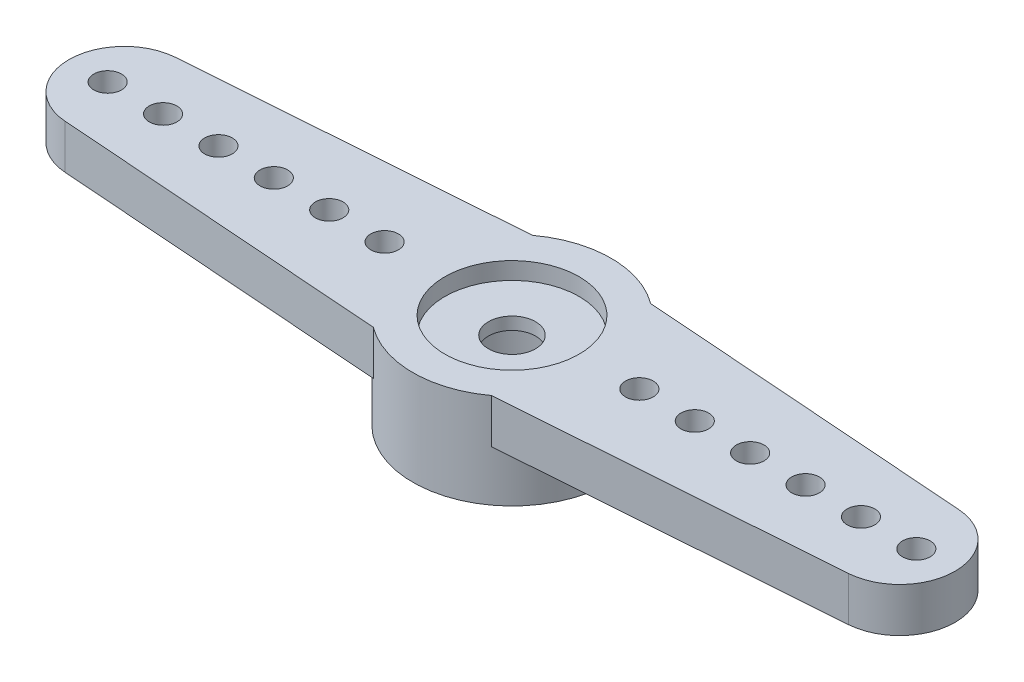
ISO-10303-21;
HEADER;
FILE_DESCRIPTION(('STEP AP214'),'2;1');
FILE_NAME('part.step','',(''),(''),'','','');
FILE_SCHEMA(('AUTOMOTIVE_DESIGN { 1 0 10303 214 1 1 1 1 }'));
ENDSEC;
DATA;
#1=APPLICATION_CONTEXT('core data for automotive mechanical design processes');
#2=APPLICATION_PROTOCOL_DEFINITION('international standard','automotive_design',2000,#1);
#3=PRODUCT_CONTEXT('',#1,'mechanical');
#4=PRODUCT('Part','Part','',(#3));
#5=PRODUCT_RELATED_PRODUCT_CATEGORY('part','',(#4));
#6=PRODUCT_DEFINITION_FORMATION('','',#4);
#7=PRODUCT_DEFINITION_CONTEXT('part definition',#1,'design');
#8=PRODUCT_DEFINITION('design','',#6,#7);
#9=PRODUCT_DEFINITION_SHAPE('','',#8);
#10=(LENGTH_UNIT() NAMED_UNIT(*) SI_UNIT(.MILLI.,.METRE.));
#11=(NAMED_UNIT(*) PLANE_ANGLE_UNIT() SI_UNIT($,.RADIAN.));
#12=(NAMED_UNIT(*) SI_UNIT($,.STERADIAN.) SOLID_ANGLE_UNIT());
#13=UNCERTAINTY_MEASURE_WITH_UNIT(LENGTH_MEASURE(1.E-05),#10,'distance_accuracy_value','');
#14=(GEOMETRIC_REPRESENTATION_CONTEXT(3) GLOBAL_UNCERTAINTY_ASSIGNED_CONTEXT((#13)) GLOBAL_UNIT_ASSIGNED_CONTEXT((#10,
#11,#12)) REPRESENTATION_CONTEXT('',''));
#15=CARTESIAN_POINT('',(0.,0.,0.));
#16=DIRECTION('',(0.,0.,1.));
#17=DIRECTION('',(1.,0.,0.));
#18=AXIS2_PLACEMENT_3D('',#15,#16,#17);
#19=CARTESIAN_POINT('',(5.9,12.67,-5.9));
#20=DIRECTION('',(0.,1.,0.));
#21=DIRECTION('',(0.,0.,1.));
#22=AXIS2_PLACEMENT_3D('',#19,#20,#21);
#23=PLANE('',#22);
#24=CARTESIAN_POINT('',(-2.7,12.67,-5.9));
#25=DIRECTION('',(0.,-1.,0.));
#26=DIRECTION('',(0.,0.,-1.));
#27=AXIS2_PLACEMENT_3D('',#24,#25,#26);
#28=CIRCLE('',#27,0.499999999999988);
#29=CARTESIAN_POINT('',(-2.7,12.67,-6.39999999999999));
#30=VERTEX_POINT('',#29);
#31=EDGE_CURVE('E491',#30,#30,#28,.T.);
#32=ORIENTED_EDGE('',*,*,#31,.F.);
#33=EDGE_LOOP('',(#32));
#34=FACE_BOUND('',#33,.T.);
#35=CARTESIAN_POINT('',(-6.7,12.67,-5.9));
#36=DIRECTION('',(0.,-1.,0.));
#37=DIRECTION('',(0.,0.,-1.));
#38=AXIS2_PLACEMENT_3D('',#35,#36,#37);
#39=CIRCLE('',#38,0.499999999999988);
#40=CARTESIAN_POINT('',(-6.7,12.67,-6.39999999999999));
#41=VERTEX_POINT('',#40);
#42=EDGE_CURVE('E493',#41,#41,#39,.T.);
#43=ORIENTED_EDGE('',*,*,#42,.F.);
#44=EDGE_LOOP('',(#43));
#45=FACE_BOUND('',#44,.T.);
#46=CARTESIAN_POINT('',(-8.7,12.67,-5.9));
#47=DIRECTION('',(0.,-1.,0.));
#48=DIRECTION('',(0.,0.,-1.));
#49=AXIS2_PLACEMENT_3D('',#46,#47,#48);
#50=CIRCLE('',#49,0.499999999999988);
#51=CARTESIAN_POINT('',(-8.7,12.67,-6.39999999999999));
#52=VERTEX_POINT('',#51);
#53=EDGE_CURVE('E499',#52,#52,#50,.T.);
#54=ORIENTED_EDGE('',*,*,#53,.F.);
#55=EDGE_LOOP('',(#54));
#56=FACE_BOUND('',#55,.T.);
#57=CARTESIAN_POINT('',(-0.699999999999997,12.67,-5.9));
#58=DIRECTION('',(0.,-1.,0.));
#59=DIRECTION('',(0.,0.,-1.));
#60=AXIS2_PLACEMENT_3D('',#57,#58,#59);
#61=CIRCLE('',#60,0.499999999999988);
#62=CARTESIAN_POINT('',(-0.699999999999997,12.67,-6.39999999999999));
#63=VERTEX_POINT('',#62);
#64=EDGE_CURVE('E507',#63,#63,#61,.T.);
#65=ORIENTED_EDGE('',*,*,#64,.F.);
#66=EDGE_LOOP('',(#65));
#67=FACE_BOUND('',#66,.T.);
#68=CARTESIAN_POINT('',(1.3,12.67,-5.9));
#69=DIRECTION('',(0.,-1.,0.));
#70=DIRECTION('',(0.,0.,-1.));
#71=AXIS2_PLACEMENT_3D('',#68,#69,#70);
#72=CIRCLE('',#71,0.499999999999988);
#73=CARTESIAN_POINT('',(1.3,12.67,-6.39999999999999));
#74=VERTEX_POINT('',#73);
#75=EDGE_CURVE('E535',#74,#74,#72,.T.);
#76=ORIENTED_EDGE('',*,*,#75,.F.);
#77=EDGE_LOOP('',(#76));
#78=FACE_BOUND('',#77,.T.);
#79=CARTESIAN_POINT('',(5.9,12.67,-5.9));
#80=DIRECTION('',(0.,-1.,0.));
#81=DIRECTION('',(0.,0.,-1.));
#82=AXIS2_PLACEMENT_3D('',#79,#80,#81);
#83=CIRCLE('',#82,3.58);
#84=CARTESIAN_POINT('',(3.76674544416284,12.67,-3.025));
#85=VERTEX_POINT('',#84);
#86=CARTESIAN_POINT('',(3.76674544416284,12.67,-8.775));
#87=VERTEX_POINT('',#86);
#88=EDGE_CURVE('E11',#85,#87,#83,.T.);
#89=ORIENTED_EDGE('',*,*,#88,.F.);
#90=DIRECTION('',(0.997325531387097,0.,0.0730875122264068));
#91=VECTOR('',#90,1.);
#92=CARTESIAN_POINT('',(-8.24617502445281,12.67,-3.90534893722581));
#93=LINE('',#92,#91);
#94=CARTESIAN_POINT('',(-8.24617502445281,12.67,-3.90534893722581));
#95=VERTEX_POINT('',#94);
#96=EDGE_CURVE('E123',#95,#85,#93,.T.);
#97=ORIENTED_EDGE('',*,*,#96,.F.);
#98=CARTESIAN_POINT('',(-8.09999999999999,12.67,-5.9));
#99=DIRECTION('',(0.,1.,0.));
#100=DIRECTION('',(0.,0.,1.));
#101=AXIS2_PLACEMENT_3D('',#98,#99,#100);
#102=CIRCLE('',#101,2.);
#103=CARTESIAN_POINT('',(-8.24617502445281,12.67,-7.8946510627742));
#104=VERTEX_POINT('',#103);
#105=EDGE_CURVE('E120',#104,#95,#102,.T.);
#106=ORIENTED_EDGE('',*,*,#105,.F.);
#107=DIRECTION('',(-0.997325531387097,0.,0.0730875122264058));
#108=VECTOR('',#107,1.);
#109=CARTESIAN_POINT('',(3.76674544416284,12.67,-8.775));
#110=LINE('',#109,#108);
#111=EDGE_CURVE('E111',#87,#104,#110,.T.);
#112=ORIENTED_EDGE('',*,*,#111,.F.);
#113=EDGE_LOOP('',(#89,#97,#106,#112));
#114=FACE_BOUND('',#113,.T.);
#115=CARTESIAN_POINT('',(-4.7,12.67,-5.9));
#116=DIRECTION('',(0.,-1.,0.));
#117=DIRECTION('',(0.,0.,-1.));
#118=AXIS2_PLACEMENT_3D('',#115,#116,#117);
#119=CIRCLE('',#118,0.499999999999988);
#120=CARTESIAN_POINT('',(-4.7,12.67,-6.39999999999999));
#121=VERTEX_POINT('',#120);
#122=EDGE_CURVE('E503',#121,#121,#119,.T.);
#123=ORIENTED_EDGE('',*,*,#122,.F.);
#124=EDGE_LOOP('',(#123));
#125=FACE_BOUND('',#124,.T.);
#126=ADVANCED_FACE('F32',(#34,#45,#56,#67,#78,#114,#125),#23,.F.);
#127=CARTESIAN_POINT('',(10.5,12.67,-5.9));
#128=DIRECTION('',(0.,-1.,0.));
#129=DIRECTION('',(0.,0.,-1.));
#130=AXIS2_PLACEMENT_3D('',#127,#128,#129);
#131=CIRCLE('',#130,0.499999999999988);
#132=CARTESIAN_POINT('',(10.5,12.67,-6.39999999999999));
#133=VERTEX_POINT('',#132);
#134=EDGE_CURVE('E511',#133,#133,#131,.T.);
#135=ORIENTED_EDGE('',*,*,#134,.F.);
#136=EDGE_LOOP('',(#135));
#137=FACE_BOUND('',#136,.T.);
#138=CARTESIAN_POINT('',(14.5,12.67,-5.9));
#139=DIRECTION('',(0.,-1.,0.));
#140=DIRECTION('',(0.,0.,-1.));
#141=AXIS2_PLACEMENT_3D('',#138,#139,#140);
#142=CIRCLE('',#141,0.499999999999988);
#143=CARTESIAN_POINT('',(14.5,12.67,-6.39999999999999));
#144=VERTEX_POINT('',#143);
#145=EDGE_CURVE('E515',#144,#144,#142,.T.);
#146=ORIENTED_EDGE('',*,*,#145,.F.);
#147=EDGE_LOOP('',(#146));
#148=FACE_BOUND('',#147,.T.);
#149=CARTESIAN_POINT('',(18.5,12.67,-5.9));
#150=DIRECTION('',(0.,-1.,0.));
#151=DIRECTION('',(0.,0.,-1.));
#152=AXIS2_PLACEMENT_3D('',#149,#150,#151);
#153=CIRCLE('',#152,0.499999999999987);
#154=CARTESIAN_POINT('',(18.5,12.67,-6.39999999999999));
#155=VERTEX_POINT('',#154);
#156=EDGE_CURVE('E519',#155,#155,#153,.T.);
#157=ORIENTED_EDGE('',*,*,#156,.F.);
#158=EDGE_LOOP('',(#157));
#159=FACE_BOUND('',#158,.T.);
#160=CARTESIAN_POINT('',(20.5,12.67,-5.9));
#161=DIRECTION('',(0.,-1.,0.));
#162=DIRECTION('',(0.,0.,-1.));
#163=AXIS2_PLACEMENT_3D('',#160,#161,#162);
#164=CIRCLE('',#163,0.499999999999987);
#165=CARTESIAN_POINT('',(20.5,12.67,-6.39999999999999));
#166=VERTEX_POINT('',#165);
#167=EDGE_CURVE('E523',#166,#166,#164,.T.);
#168=ORIENTED_EDGE('',*,*,#167,.F.);
#169=EDGE_LOOP('',(#168));
#170=FACE_BOUND('',#169,.T.);
#171=CARTESIAN_POINT('',(16.5,12.67,-5.9));
#172=DIRECTION('',(0.,-1.,0.));
#173=DIRECTION('',(0.,0.,-1.));
#174=AXIS2_PLACEMENT_3D('',#171,#172,#173);
#175=CIRCLE('',#174,0.499999999999987);
#176=CARTESIAN_POINT('',(16.5,12.67,-6.39999999999999));
#177=VERTEX_POINT('',#176);
#178=EDGE_CURVE('E527',#177,#177,#175,.T.);
#179=ORIENTED_EDGE('',*,*,#178,.F.);
#180=EDGE_LOOP('',(#179));
#181=FACE_BOUND('',#180,.T.);
#182=CARTESIAN_POINT('',(12.5,12.67,-5.9));
#183=DIRECTION('',(0.,-1.,0.));
#184=DIRECTION('',(0.,0.,-1.));
#185=AXIS2_PLACEMENT_3D('',#182,#183,#184);
#186=CIRCLE('',#185,0.499999999999988);
#187=CARTESIAN_POINT('',(12.5,12.67,-6.39999999999999));
#188=VERTEX_POINT('',#187);
#189=EDGE_CURVE('E531',#188,#188,#186,.T.);
#190=ORIENTED_EDGE('',*,*,#189,.F.);
#191=EDGE_LOOP('',(#190));
#192=FACE_BOUND('',#191,.T.);
#193=CARTESIAN_POINT('',(8.03325455583716,12.67,-8.775));
#194=VERTEX_POINT('',#193);
#195=CARTESIAN_POINT('',(8.03325455583716,12.67,-3.025));
#196=VERTEX_POINT('',#195);
#197=EDGE_CURVE('E44',#194,#196,#83,.T.);
#198=ORIENTED_EDGE('',*,*,#197,.F.);
#199=DIRECTION('',(-0.997325531387097,0.,-0.0730875122264069));
#200=VECTOR('',#199,1.);
#201=CARTESIAN_POINT('',(20.0461750244528,12.67,-7.89465106277419));
#202=LINE('',#201,#200);
#203=CARTESIAN_POINT('',(20.0461750244528,12.67,-7.89465106277419));
#204=VERTEX_POINT('',#203);
#205=EDGE_CURVE('E121',#204,#194,#202,.T.);
#206=ORIENTED_EDGE('',*,*,#205,.F.);
#207=CARTESIAN_POINT('',(19.9,12.67,-5.9));
#208=DIRECTION('',(0.,1.,0.));
#209=DIRECTION('',(0.,0.,1.));
#210=AXIS2_PLACEMENT_3D('',#207,#208,#209);
#211=CIRCLE('',#210,2.);
#212=CARTESIAN_POINT('',(20.0461750244528,12.67,-3.90534893722581));
#213=VERTEX_POINT('',#212);
#214=EDGE_CURVE('E126',#213,#204,#211,.T.);
#215=ORIENTED_EDGE('',*,*,#214,.F.);
#216=DIRECTION('',(0.997325531387097,0.,-0.0730875122264059));
#217=VECTOR('',#216,1.);
#218=CARTESIAN_POINT('',(8.03325455583716,12.67,-3.025));
#219=LINE('',#218,#217);
#220=EDGE_CURVE('E152',#196,#213,#219,.T.);
#221=ORIENTED_EDGE('',*,*,#220,.F.);
#222=EDGE_LOOP('',(#198,#206,#215,#221));
#223=FACE_BOUND('',#222,.T.);
#224=ADVANCED_FACE('F172',(#137,#148,#159,#170,#181,#192,#223),#23,.F.);
#225=CARTESIAN_POINT('',(-8.24617502445281,12.67,-3.90534893722581));
#226=DIRECTION('',(-0.0730875122264068,0.,0.997325531387097));
#227=DIRECTION('',(0.997325531387097,0.,0.0730875122264068));
#228=AXIS2_PLACEMENT_3D('',#225,#226,#227);
#229=PLANE('',#228);
#230=DIRECTION('',(0.997325531387097,0.,0.0730875122264068));
#231=VECTOR('',#230,1.);
#232=CARTESIAN_POINT('',(-8.24617502445281,14.27,-3.90534893722581));
#233=LINE('',#232,#231);
#234=CARTESIAN_POINT('',(-8.24617502445281,14.27,-3.90534893722581));
#235=VERTEX_POINT('',#234);
#236=CARTESIAN_POINT('',(3.76674544416284,14.27,-3.025));
#237=VERTEX_POINT('',#236);
#238=EDGE_CURVE('E149',#235,#237,#233,.T.);
#239=ORIENTED_EDGE('',*,*,#238,.F.);
#240=DIRECTION('',(0.,1.,0.));
#241=VECTOR('',#240,1.);
#242=CARTESIAN_POINT('',(-8.24617502445281,12.67,-3.90534893722581));
#243=LINE('',#242,#241);
#244=EDGE_CURVE('E52',#95,#235,#243,.T.);
#245=ORIENTED_EDGE('',*,*,#244,.F.);
#246=ORIENTED_EDGE('',*,*,#96,.T.);
#247=DIRECTION('',(0.,1.,0.));
#248=VECTOR('',#247,1.);
#249=CARTESIAN_POINT('',(3.76674544416284,12.67,-3.025));
#250=LINE('',#249,#248);
#251=EDGE_CURVE('E42',#85,#237,#250,.T.);
#252=ORIENTED_EDGE('',*,*,#251,.T.);
#253=EDGE_LOOP('',(#239,#245,#246,#252));
#254=FACE_BOUND('',#253,.T.);
#255=ADVANCED_FACE('F169',(#254),#229,.T.);
#256=CARTESIAN_POINT('',(-8.09999999999999,12.67,-5.9));
#257=DIRECTION('',(0.,1.,0.));
#258=DIRECTION('',(0.,0.,1.));
#259=AXIS2_PLACEMENT_3D('',#256,#257,#258);
#260=CYLINDRICAL_SURFACE('',#259,2.);
#261=CARTESIAN_POINT('',(-8.09999999999999,14.27,-5.9));
#262=DIRECTION('',(0.,1.,0.));
#263=DIRECTION('',(0.,0.,1.));
#264=AXIS2_PLACEMENT_3D('',#261,#262,#263);
#265=CIRCLE('',#264,2.);
#266=CARTESIAN_POINT('',(-8.24617502445281,14.27,-7.8946510627742));
#267=VERTEX_POINT('',#266);
#268=EDGE_CURVE('E147',#267,#235,#265,.T.);
#269=ORIENTED_EDGE('',*,*,#268,.F.);
#270=DIRECTION('',(0.,1.,0.));
#271=VECTOR('',#270,1.);
#272=CARTESIAN_POINT('',(-8.24617502445281,12.67,-7.8946510627742));
#273=LINE('',#272,#271);
#274=EDGE_CURVE('E115',#104,#267,#273,.T.);
#275=ORIENTED_EDGE('',*,*,#274,.F.);
#276=ORIENTED_EDGE('',*,*,#105,.T.);
#277=ORIENTED_EDGE('',*,*,#244,.T.);
#278=EDGE_LOOP('',(#269,#275,#276,#277));
#279=FACE_BOUND('',#278,.T.);
#280=ADVANCED_FACE('F171',(#279),#260,.T.);
#281=CARTESIAN_POINT('',(3.76674544416284,12.67,-8.775));
#282=DIRECTION('',(-0.0730875122264058,0.,-0.997325531387097));
#283=DIRECTION('',(-0.997325531387097,0.,0.0730875122264058));
#284=AXIS2_PLACEMENT_3D('',#281,#282,#283);
#285=PLANE('',#284);
#286=DIRECTION('',(-0.997325531387097,0.,0.0730875122264058));
#287=VECTOR('',#286,1.);
#288=CARTESIAN_POINT('',(3.76674544416284,14.27,-8.775));
#289=LINE('',#288,#287);
#290=CARTESIAN_POINT('',(3.76674544416284,14.27,-8.775));
#291=VERTEX_POINT('',#290);
#292=EDGE_CURVE('E113',#291,#267,#289,.T.);
#293=ORIENTED_EDGE('',*,*,#292,.F.);
#294=DIRECTION('',(0.,1.,0.));
#295=VECTOR('',#294,1.);
#296=CARTESIAN_POINT('',(3.76674544416284,12.67,-8.775));
#297=LINE('',#296,#295);
#298=EDGE_CURVE('E103',#87,#291,#297,.T.);
#299=ORIENTED_EDGE('',*,*,#298,.F.);
#300=ORIENTED_EDGE('',*,*,#111,.T.);
#301=ORIENTED_EDGE('',*,*,#274,.T.);
#302=EDGE_LOOP('',(#293,#299,#300,#301));
#303=FACE_BOUND('',#302,.T.);
#304=ADVANCED_FACE('F110',(#303),#285,.T.);
#305=CARTESIAN_POINT('',(5.9,12.67,-5.9));
#306=DIRECTION('',(0.,1.,0.));
#307=DIRECTION('',(0.,0.,1.));
#308=AXIS2_PLACEMENT_3D('',#305,#306,#307);
#309=CYLINDRICAL_SURFACE('',#308,3.58);
#310=CARTESIAN_POINT('',(5.9,14.27,-5.9));
#311=DIRECTION('',(0.,1.,0.));
#312=DIRECTION('',(0.,0.,1.));
#313=AXIS2_PLACEMENT_3D('',#310,#311,#312);
#314=CIRCLE('',#313,3.58);
#315=CARTESIAN_POINT('',(8.03325455583716,14.27,-8.775));
#316=VERTEX_POINT('',#315);
#317=EDGE_CURVE('E144',#316,#291,#314,.T.);
#318=ORIENTED_EDGE('',*,*,#317,.F.);
#319=DIRECTION('',(0.,1.,0.));
#320=VECTOR('',#319,1.);
#321=CARTESIAN_POINT('',(8.03325455583716,12.67,-8.775));
#322=LINE('',#321,#320);
#323=EDGE_CURVE('E116',#194,#316,#322,.T.);
#324=ORIENTED_EDGE('',*,*,#323,.F.);
#325=ORIENTED_EDGE('',*,*,#197,.T.);
#326=DIRECTION('',(0.,1.,0.));
#327=VECTOR('',#326,1.);
#328=CARTESIAN_POINT('',(8.03325455583716,12.67,-3.025));
#329=LINE('',#328,#327);
#330=CARTESIAN_POINT('',(8.03325455583716,14.27,-3.025));
#331=VERTEX_POINT('',#330);
#332=EDGE_CURVE('E36',#196,#331,#329,.T.);
#333=ORIENTED_EDGE('',*,*,#332,.T.);
#334=CARTESIAN_POINT('',(5.9,14.27,-5.9));
#335=DIRECTION('',(0.,1.,0.));
#336=DIRECTION('',(0.,0.,1.));
#337=AXIS2_PLACEMENT_3D('',#334,#335,#336);
#338=CIRCLE('',#337,3.58);
#339=EDGE_CURVE('E131',#237,#331,#338,.T.);
#340=ORIENTED_EDGE('',*,*,#339,.F.);
#341=ORIENTED_EDGE('',*,*,#251,.F.);
#342=ORIENTED_EDGE('',*,*,#88,.T.);
#343=ORIENTED_EDGE('',*,*,#298,.T.);
#344=EDGE_LOOP('',(#318,#324,#325,#333,#340,#341,#342,#343));
#345=FACE_BOUND('',#344,.T.);
#346=CARTESIAN_POINT('',(5.9,10.84,-5.9));
#347=DIRECTION('',(0.,-1.,0.));
#348=DIRECTION('',(0.,0.,-1.));
#349=AXIS2_PLACEMENT_3D('',#346,#347,#348);
#350=CIRCLE('',#349,3.58);
#351=CARTESIAN_POINT('',(5.9,10.84,-9.48));
#352=VERTEX_POINT('',#351);
#353=EDGE_CURVE('E135',#352,#352,#350,.T.);
#354=ORIENTED_EDGE('',*,*,#353,.F.);
#355=EDGE_LOOP('',(#354));
#356=FACE_BOUND('',#355,.T.);
#357=ADVANCED_FACE('F101',(#345,#356),#309,.T.);
#358=CARTESIAN_POINT('',(20.0461750244528,12.67,-7.89465106277419));
#359=DIRECTION('',(0.0730875122264068,0.,-0.997325531387097));
#360=DIRECTION('',(-0.997325531387097,0.,-0.0730875122264069));
#361=AXIS2_PLACEMENT_3D('',#358,#359,#360);
#362=PLANE('',#361);
#363=DIRECTION('',(-0.997325531387097,0.,-0.0730875122264069));
#364=VECTOR('',#363,1.);
#365=CARTESIAN_POINT('',(20.0461750244528,14.27,-7.89465106277419));
#366=LINE('',#365,#364);
#367=CARTESIAN_POINT('',(20.0461750244528,14.27,-7.89465106277419));
#368=VERTEX_POINT('',#367);
#369=EDGE_CURVE('E141',#368,#316,#366,.T.);
#370=ORIENTED_EDGE('',*,*,#369,.F.);
#371=DIRECTION('',(0.,1.,0.));
#372=VECTOR('',#371,1.);
#373=CARTESIAN_POINT('',(20.0461750244528,12.67,-7.89465106277419));
#374=LINE('',#373,#372);
#375=EDGE_CURVE('E157',#204,#368,#374,.T.);
#376=ORIENTED_EDGE('',*,*,#375,.F.);
#377=ORIENTED_EDGE('',*,*,#205,.T.);
#378=ORIENTED_EDGE('',*,*,#323,.T.);
#379=EDGE_LOOP('',(#370,#376,#377,#378));
#380=FACE_BOUND('',#379,.T.);
#381=ADVANCED_FACE('F266',(#380),#362,.T.);
#382=CARTESIAN_POINT('',(19.9,12.67,-5.9));
#383=DIRECTION('',(0.,1.,0.));
#384=DIRECTION('',(0.,0.,1.));
#385=AXIS2_PLACEMENT_3D('',#382,#383,#384);
#386=CYLINDRICAL_SURFACE('',#385,2.);
#387=CARTESIAN_POINT('',(19.9,14.27,-5.9));
#388=DIRECTION('',(0.,1.,0.));
#389=DIRECTION('',(0.,0.,1.));
#390=AXIS2_PLACEMENT_3D('',#387,#388,#389);
#391=CIRCLE('',#390,2.);
#392=CARTESIAN_POINT('',(20.0461750244528,14.27,-3.90534893722581));
#393=VERTEX_POINT('',#392);
#394=EDGE_CURVE('E138',#393,#368,#391,.T.);
#395=ORIENTED_EDGE('',*,*,#394,.F.);
#396=DIRECTION('',(0.,1.,0.));
#397=VECTOR('',#396,1.);
#398=CARTESIAN_POINT('',(20.0461750244528,12.67,-3.90534893722581));
#399=LINE('',#398,#397);
#400=EDGE_CURVE('E91',#213,#393,#399,.T.);
#401=ORIENTED_EDGE('',*,*,#400,.F.);
#402=ORIENTED_EDGE('',*,*,#214,.T.);
#403=ORIENTED_EDGE('',*,*,#375,.T.);
#404=EDGE_LOOP('',(#395,#401,#402,#403));
#405=FACE_BOUND('',#404,.T.);
#406=ADVANCED_FACE('F199',(#405),#386,.T.);
#407=CARTESIAN_POINT('',(8.03325455583716,12.67,-3.025));
#408=DIRECTION('',(0.0730875122264059,0.,0.997325531387097));
#409=DIRECTION('',(0.997325531387097,0.,-0.0730875122264059));
#410=AXIS2_PLACEMENT_3D('',#407,#408,#409);
#411=PLANE('',#410);
#412=DIRECTION('',(0.997325531387097,0.,-0.0730875122264059));
#413=VECTOR('',#412,1.);
#414=CARTESIAN_POINT('',(8.03325455583716,14.27,-3.025));
#415=LINE('',#414,#413);
#416=EDGE_CURVE('E134',#331,#393,#415,.T.);
#417=ORIENTED_EDGE('',*,*,#416,.F.);
#418=ORIENTED_EDGE('',*,*,#332,.F.);
#419=ORIENTED_EDGE('',*,*,#220,.T.);
#420=ORIENTED_EDGE('',*,*,#400,.T.);
#421=EDGE_LOOP('',(#417,#418,#419,#420));
#422=FACE_BOUND('',#421,.T.);
#423=ADVANCED_FACE('F34',(#422),#411,.T.);
#424=CARTESIAN_POINT('',(5.9,14.27,-5.9));
#425=DIRECTION('',(0.,1.,0.));
#426=DIRECTION('',(0.,0.,1.));
#427=AXIS2_PLACEMENT_3D('',#424,#425,#426);
#428=PLANE('',#427);
#429=CARTESIAN_POINT('',(-2.7,14.27,-5.9));
#430=DIRECTION('',(0.,-1.,0.));
#431=DIRECTION('',(0.,0.,-1.));
#432=AXIS2_PLACEMENT_3D('',#429,#430,#431);
#433=CIRCLE('',#432,0.499999999999988);
#434=CARTESIAN_POINT('',(-2.7,14.27,-6.39999999999999));
#435=VERTEX_POINT('',#434);
#436=EDGE_CURVE('E203',#435,#435,#433,.T.);
#437=ORIENTED_EDGE('',*,*,#436,.T.);
#438=EDGE_LOOP('',(#437));
#439=FACE_BOUND('',#438,.T.);
#440=CARTESIAN_POINT('',(-6.7,14.27,-5.9));
#441=DIRECTION('',(0.,-1.,0.));
#442=DIRECTION('',(0.,0.,-1.));
#443=AXIS2_PLACEMENT_3D('',#440,#441,#442);
#444=CIRCLE('',#443,0.499999999999987);
#445=CARTESIAN_POINT('',(-6.7,14.27,-6.39999999999999));
#446=VERTEX_POINT('',#445);
#447=EDGE_CURVE('E207',#446,#446,#444,.T.);
#448=ORIENTED_EDGE('',*,*,#447,.T.);
#449=EDGE_LOOP('',(#448));
#450=FACE_BOUND('',#449,.T.);
#451=CARTESIAN_POINT('',(-8.7,14.27,-5.9));
#452=DIRECTION('',(0.,-1.,0.));
#453=DIRECTION('',(0.,0.,-1.));
#454=AXIS2_PLACEMENT_3D('',#451,#452,#453);
#455=CIRCLE('',#454,0.499999999999988);
#456=CARTESIAN_POINT('',(-8.7,14.27,-6.39999999999999));
#457=VERTEX_POINT('',#456);
#458=EDGE_CURVE('E211',#457,#457,#455,.T.);
#459=ORIENTED_EDGE('',*,*,#458,.T.);
#460=EDGE_LOOP('',(#459));
#461=FACE_BOUND('',#460,.T.);
#462=CARTESIAN_POINT('',(-4.7,14.27,-5.9));
#463=DIRECTION('',(0.,-1.,0.));
#464=DIRECTION('',(0.,0.,-1.));
#465=AXIS2_PLACEMENT_3D('',#462,#463,#464);
#466=CIRCLE('',#465,0.499999999999987);
#467=CARTESIAN_POINT('',(-4.7,14.27,-6.39999999999999));
#468=VERTEX_POINT('',#467);
#469=EDGE_CURVE('E215',#468,#468,#466,.T.);
#470=ORIENTED_EDGE('',*,*,#469,.T.);
#471=EDGE_LOOP('',(#470));
#472=FACE_BOUND('',#471,.T.);
#473=CARTESIAN_POINT('',(-0.699999999999997,14.27,-5.9));
#474=DIRECTION('',(0.,-1.,0.));
#475=DIRECTION('',(0.,0.,-1.));
#476=AXIS2_PLACEMENT_3D('',#473,#474,#475);
#477=CIRCLE('',#476,0.499999999999988);
#478=CARTESIAN_POINT('',(-0.699999999999997,14.27,-6.39999999999999));
#479=VERTEX_POINT('',#478);
#480=EDGE_CURVE('E219',#479,#479,#477,.T.);
#481=ORIENTED_EDGE('',*,*,#480,.T.);
#482=EDGE_LOOP('',(#481));
#483=FACE_BOUND('',#482,.T.);
#484=CARTESIAN_POINT('',(10.5,14.27,-5.9));
#485=DIRECTION('',(0.,-1.,0.));
#486=DIRECTION('',(0.,0.,-1.));
#487=AXIS2_PLACEMENT_3D('',#484,#485,#486);
#488=CIRCLE('',#487,0.499999999999988);
#489=CARTESIAN_POINT('',(10.5,14.27,-6.39999999999999));
#490=VERTEX_POINT('',#489);
#491=EDGE_CURVE('E223',#490,#490,#488,.T.);
#492=ORIENTED_EDGE('',*,*,#491,.T.);
#493=EDGE_LOOP('',(#492));
#494=FACE_BOUND('',#493,.T.);
#495=CARTESIAN_POINT('',(14.5,14.27,-5.9));
#496=DIRECTION('',(0.,-1.,0.));
#497=DIRECTION('',(0.,0.,-1.));
#498=AXIS2_PLACEMENT_3D('',#495,#496,#497);
#499=CIRCLE('',#498,0.499999999999988);
#500=CARTESIAN_POINT('',(14.5,14.27,-6.39999999999999));
#501=VERTEX_POINT('',#500);
#502=EDGE_CURVE('E227',#501,#501,#499,.T.);
#503=ORIENTED_EDGE('',*,*,#502,.T.);
#504=EDGE_LOOP('',(#503));
#505=FACE_BOUND('',#504,.T.);
#506=CARTESIAN_POINT('',(18.5,14.27,-5.9));
#507=DIRECTION('',(0.,-1.,0.));
#508=DIRECTION('',(0.,0.,-1.));
#509=AXIS2_PLACEMENT_3D('',#506,#507,#508);
#510=CIRCLE('',#509,0.499999999999987);
#511=CARTESIAN_POINT('',(18.5,14.27,-6.39999999999999));
#512=VERTEX_POINT('',#511);
#513=EDGE_CURVE('E231',#512,#512,#510,.T.);
#514=ORIENTED_EDGE('',*,*,#513,.T.);
#515=EDGE_LOOP('',(#514));
#516=FACE_BOUND('',#515,.T.);
#517=CARTESIAN_POINT('',(20.5,14.27,-5.9));
#518=DIRECTION('',(0.,-1.,0.));
#519=DIRECTION('',(0.,0.,-1.));
#520=AXIS2_PLACEMENT_3D('',#517,#518,#519);
#521=CIRCLE('',#520,0.499999999999987);
#522=CARTESIAN_POINT('',(20.5,14.27,-6.39999999999999));
#523=VERTEX_POINT('',#522);
#524=EDGE_CURVE('E235',#523,#523,#521,.T.);
#525=ORIENTED_EDGE('',*,*,#524,.T.);
#526=EDGE_LOOP('',(#525));
#527=FACE_BOUND('',#526,.T.);
#528=CARTESIAN_POINT('',(16.5,14.27,-5.9));
#529=DIRECTION('',(0.,-1.,0.));
#530=DIRECTION('',(0.,0.,-1.));
#531=AXIS2_PLACEMENT_3D('',#528,#529,#530);
#532=CIRCLE('',#531,0.499999999999987);
#533=CARTESIAN_POINT('',(16.5,14.27,-6.39999999999999));
#534=VERTEX_POINT('',#533);
#535=EDGE_CURVE('E239',#534,#534,#532,.T.);
#536=ORIENTED_EDGE('',*,*,#535,.T.);
#537=EDGE_LOOP('',(#536));
#538=FACE_BOUND('',#537,.T.);
#539=CARTESIAN_POINT('',(12.5,14.27,-5.9));
#540=DIRECTION('',(0.,-1.,0.));
#541=DIRECTION('',(0.,0.,-1.));
#542=AXIS2_PLACEMENT_3D('',#539,#540,#541);
#543=CIRCLE('',#542,0.499999999999988);
#544=CARTESIAN_POINT('',(12.5,14.27,-6.39999999999999));
#545=VERTEX_POINT('',#544);
#546=EDGE_CURVE('E243',#545,#545,#543,.T.);
#547=ORIENTED_EDGE('',*,*,#546,.T.);
#548=EDGE_LOOP('',(#547));
#549=FACE_BOUND('',#548,.T.);
#550=CARTESIAN_POINT('',(1.3,14.27,-5.9));
#551=DIRECTION('',(0.,-1.,0.));
#552=DIRECTION('',(0.,0.,-1.));
#553=AXIS2_PLACEMENT_3D('',#550,#551,#552);
#554=CIRCLE('',#553,0.499999999999988);
#555=CARTESIAN_POINT('',(1.3,14.27,-6.39999999999999));
#556=VERTEX_POINT('',#555);
#557=EDGE_CURVE('E247',#556,#556,#554,.T.);
#558=ORIENTED_EDGE('',*,*,#557,.T.);
#559=EDGE_LOOP('',(#558));
#560=FACE_BOUND('',#559,.T.);
#561=CARTESIAN_POINT('',(5.9,14.27,-5.9));
#562=DIRECTION('',(0.,-1.,0.));
#563=DIRECTION('',(0.,0.,-1.));
#564=AXIS2_PLACEMENT_3D('',#561,#562,#563);
#565=CIRCLE('',#564,2.425);
#566=CARTESIAN_POINT('',(5.9,14.27,-8.325));
#567=VERTEX_POINT('',#566);
#568=EDGE_CURVE('E250',#567,#567,#565,.T.);
#569=ORIENTED_EDGE('',*,*,#568,.T.);
#570=EDGE_LOOP('',(#569));
#571=FACE_BOUND('',#570,.T.);
#572=ORIENTED_EDGE('',*,*,#339,.T.);
#573=ORIENTED_EDGE('',*,*,#416,.T.);
#574=ORIENTED_EDGE('',*,*,#394,.T.);
#575=ORIENTED_EDGE('',*,*,#369,.T.);
#576=ORIENTED_EDGE('',*,*,#317,.T.);
#577=ORIENTED_EDGE('',*,*,#292,.T.);
#578=ORIENTED_EDGE('',*,*,#268,.T.);
#579=ORIENTED_EDGE('',*,*,#238,.T.);
#580=EDGE_LOOP('',(#572,#573,#574,#575,#576,#577,#578,#579));
#581=FACE_BOUND('',#580,.T.);
#582=ADVANCED_FACE('F168',(#439,#450,#461,#472,#483,#494,#505,#516,#527,#538,#549,#560,#571,
#581),#428,.T.);
#583=CARTESIAN_POINT('',(5.9,10.84,-5.9));
#584=DIRECTION('',(0.,-1.,0.));
#585=DIRECTION('',(0.,0.,-1.));
#586=AXIS2_PLACEMENT_3D('',#583,#584,#585);
#587=PLANE('',#586);
#588=CARTESIAN_POINT('',(5.9,10.84,-5.9));
#589=DIRECTION('',(0.,-1.,0.));
#590=DIRECTION('',(0.,0.,-1.));
#591=AXIS2_PLACEMENT_3D('',#588,#589,#590);
#592=CIRCLE('',#591,2.3);
#593=CARTESIAN_POINT('',(5.9,10.84,-8.2));
#594=VERTEX_POINT('',#593);
#595=EDGE_CURVE('E252',#594,#594,#592,.T.);
#596=ORIENTED_EDGE('',*,*,#595,.F.);
#597=EDGE_LOOP('',(#596));
#598=FACE_BOUND('',#597,.T.);
#599=ORIENTED_EDGE('',*,*,#353,.T.);
#600=EDGE_LOOP('',(#599));
#601=FACE_BOUND('',#600,.T.);
#602=ADVANCED_FACE('F189',(#598,#601),#587,.T.);
#603=CARTESIAN_POINT('',(5.9,14.27,-5.9));
#604=DIRECTION('',(0.,-1.,0.));
#605=DIRECTION('',(0.,0.,-1.));
#606=AXIS2_PLACEMENT_3D('',#603,#604,#605);
#607=CYLINDRICAL_SURFACE('',#606,2.425);
#608=ORIENTED_EDGE('',*,*,#568,.F.);
#609=EDGE_LOOP('',(#608));
#610=FACE_BOUND('',#609,.T.);
#611=CARTESIAN_POINT('',(5.9,13.65,-5.9));
#612=DIRECTION('',(0.,-1.,0.));
#613=DIRECTION('',(0.,0.,-1.));
#614=AXIS2_PLACEMENT_3D('',#611,#612,#613);
#615=CIRCLE('',#614,2.425);
#616=CARTESIAN_POINT('',(5.9,13.65,-8.325));
#617=VERTEX_POINT('',#616);
#618=EDGE_CURVE('E539',#617,#617,#615,.T.);
#619=ORIENTED_EDGE('',*,*,#618,.T.);
#620=EDGE_LOOP('',(#619));
#621=FACE_BOUND('',#620,.T.);
#622=ADVANCED_FACE('F197',(#610,#621),#607,.F.);
#623=CARTESIAN_POINT('',(5.9,14.27,-5.9));
#624=DIRECTION('',(0.,-1.,0.));
#625=DIRECTION('',(0.,0.,-1.));
#626=AXIS2_PLACEMENT_3D('',#623,#624,#625);
#627=CYLINDRICAL_SURFACE('',#626,2.3);
#628=CARTESIAN_POINT('',(5.9,13.2,-5.9));
#629=DIRECTION('',(0.,-1.,0.));
#630=DIRECTION('',(0.,0.,-1.));
#631=AXIS2_PLACEMENT_3D('',#628,#629,#630);
#632=CIRCLE('',#631,2.3);
#633=CARTESIAN_POINT('',(5.9,13.2,-8.2));
#634=VERTEX_POINT('',#633);
#635=EDGE_CURVE('E255',#634,#634,#632,.T.);
#636=ORIENTED_EDGE('',*,*,#635,.F.);
#637=EDGE_LOOP('',(#636));
#638=FACE_BOUND('',#637,.T.);
#639=ORIENTED_EDGE('',*,*,#595,.T.);
#640=EDGE_LOOP('',(#639));
#641=FACE_BOUND('',#640,.T.);
#642=ADVANCED_FACE('F314',(#638,#641),#627,.F.);
#643=CARTESIAN_POINT('',(8.2,13.2,-5.9));
#644=DIRECTION('',(0.,1.,0.));
#645=DIRECTION('',(0.,0.,1.));
#646=AXIS2_PLACEMENT_3D('',#643,#644,#645);
#647=PLANE('',#646);
#648=CARTESIAN_POINT('',(5.9,13.2,-5.9));
#649=DIRECTION('',(0.,-1.,0.));
#650=DIRECTION('',(0.,0.,-1.));
#651=AXIS2_PLACEMENT_3D('',#648,#649,#650);
#652=CIRCLE('',#651,0.850000000000001);
#653=CARTESIAN_POINT('',(5.9,13.2,-6.75));
#654=VERTEX_POINT('',#653);
#655=EDGE_CURVE('E545',#654,#654,#652,.T.);
#656=ORIENTED_EDGE('',*,*,#655,.F.);
#657=EDGE_LOOP('',(#656));
#658=FACE_BOUND('',#657,.T.);
#659=ORIENTED_EDGE('',*,*,#635,.T.);
#660=EDGE_LOOP('',(#659));
#661=FACE_BOUND('',#660,.T.);
#662=ADVANCED_FACE('F322',(#658,#661),#647,.F.);
#663=CARTESIAN_POINT('',(5.9,14.27,-5.9));
#664=DIRECTION('',(0.,-1.,0.));
#665=DIRECTION('',(0.,0.,-1.));
#666=AXIS2_PLACEMENT_3D('',#663,#664,#665);
#667=CYLINDRICAL_SURFACE('',#666,0.850000000000001);
#668=CARTESIAN_POINT('',(5.9,13.65,-5.9));
#669=DIRECTION('',(0.,-1.,0.));
#670=DIRECTION('',(0.,0.,-1.));
#671=AXIS2_PLACEMENT_3D('',#668,#669,#670);
#672=CIRCLE('',#671,0.850000000000001);
#673=CARTESIAN_POINT('',(5.9,13.65,-6.75));
#674=VERTEX_POINT('',#673);
#675=EDGE_CURVE('E542',#674,#674,#672,.T.);
#676=ORIENTED_EDGE('',*,*,#675,.F.);
#677=EDGE_LOOP('',(#676));
#678=FACE_BOUND('',#677,.T.);
#679=ORIENTED_EDGE('',*,*,#655,.T.);
#680=EDGE_LOOP('',(#679));
#681=FACE_BOUND('',#680,.T.);
#682=ADVANCED_FACE('F332',(#678,#681),#667,.F.);
#683=CARTESIAN_POINT('',(6.75,13.65,-5.9));
#684=DIRECTION('',(0.,-1.,0.));
#685=DIRECTION('',(0.,0.,-1.));
#686=AXIS2_PLACEMENT_3D('',#683,#684,#685);
#687=PLANE('',#686);
#688=ORIENTED_EDGE('',*,*,#618,.F.);
#689=EDGE_LOOP('',(#688));
#690=FACE_BOUND('',#689,.T.);
#691=ORIENTED_EDGE('',*,*,#675,.T.);
#692=EDGE_LOOP('',(#691));
#693=FACE_BOUND('',#692,.T.);
#694=ADVANCED_FACE('F342',(#690,#693),#687,.F.);
#695=CARTESIAN_POINT('',(1.3,12.67,-5.9));
#696=DIRECTION('',(0.,-1.,0.));
#697=DIRECTION('',(0.,0.,-1.));
#698=AXIS2_PLACEMENT_3D('',#695,#696,#697);
#699=CYLINDRICAL_SURFACE('',#698,0.499999999999988);
#700=ORIENTED_EDGE('',*,*,#557,.F.);
#701=EDGE_LOOP('',(#700));
#702=FACE_BOUND('',#701,.T.);
#703=ORIENTED_EDGE('',*,*,#75,.T.);
#704=EDGE_LOOP('',(#703));
#705=FACE_BOUND('',#704,.T.);
#706=ADVANCED_FACE('F351',(#702,#705),#699,.F.);
#707=CARTESIAN_POINT('',(12.5,12.67,-5.9));
#708=DIRECTION('',(0.,-1.,0.));
#709=DIRECTION('',(0.,0.,-1.));
#710=AXIS2_PLACEMENT_3D('',#707,#708,#709);
#711=CYLINDRICAL_SURFACE('',#710,0.499999999999988);
#712=ORIENTED_EDGE('',*,*,#546,.F.);
#713=EDGE_LOOP('',(#712));
#714=FACE_BOUND('',#713,.T.);
#715=ORIENTED_EDGE('',*,*,#189,.T.);
#716=EDGE_LOOP('',(#715));
#717=FACE_BOUND('',#716,.T.);
#718=ADVANCED_FACE('F375',(#714,#717),#711,.F.);
#719=CARTESIAN_POINT('',(16.5,12.67,-5.9));
#720=DIRECTION('',(0.,-1.,0.));
#721=DIRECTION('',(0.,0.,-1.));
#722=AXIS2_PLACEMENT_3D('',#719,#720,#721);
#723=CYLINDRICAL_SURFACE('',#722,0.499999999999987);
#724=ORIENTED_EDGE('',*,*,#535,.F.);
#725=EDGE_LOOP('',(#724));
#726=FACE_BOUND('',#725,.T.);
#727=ORIENTED_EDGE('',*,*,#178,.T.);
#728=EDGE_LOOP('',(#727));
#729=FACE_BOUND('',#728,.T.);
#730=ADVANCED_FACE('F385',(#726,#729),#723,.F.);
#731=CARTESIAN_POINT('',(20.5,12.67,-5.9));
#732=DIRECTION('',(0.,-1.,0.));
#733=DIRECTION('',(0.,0.,-1.));
#734=AXIS2_PLACEMENT_3D('',#731,#732,#733);
#735=CYLINDRICAL_SURFACE('',#734,0.499999999999987);
#736=ORIENTED_EDGE('',*,*,#524,.F.);
#737=EDGE_LOOP('',(#736));
#738=FACE_BOUND('',#737,.T.);
#739=ORIENTED_EDGE('',*,*,#167,.T.);
#740=EDGE_LOOP('',(#739));
#741=FACE_BOUND('',#740,.T.);
#742=ADVANCED_FACE('F395',(#738,#741),#735,.F.);
#743=CARTESIAN_POINT('',(18.5,12.67,-5.9));
#744=DIRECTION('',(0.,-1.,0.));
#745=DIRECTION('',(0.,0.,-1.));
#746=AXIS2_PLACEMENT_3D('',#743,#744,#745);
#747=CYLINDRICAL_SURFACE('',#746,0.499999999999987);
#748=ORIENTED_EDGE('',*,*,#513,.F.);
#749=EDGE_LOOP('',(#748));
#750=FACE_BOUND('',#749,.T.);
#751=ORIENTED_EDGE('',*,*,#156,.T.);
#752=EDGE_LOOP('',(#751));
#753=FACE_BOUND('',#752,.T.);
#754=ADVANCED_FACE('F405',(#750,#753),#747,.F.);
#755=CARTESIAN_POINT('',(14.5,12.67,-5.9));
#756=DIRECTION('',(0.,-1.,0.));
#757=DIRECTION('',(0.,0.,-1.));
#758=AXIS2_PLACEMENT_3D('',#755,#756,#757);
#759=CYLINDRICAL_SURFACE('',#758,0.499999999999988);
#760=ORIENTED_EDGE('',*,*,#502,.F.);
#761=EDGE_LOOP('',(#760));
#762=FACE_BOUND('',#761,.T.);
#763=ORIENTED_EDGE('',*,*,#145,.T.);
#764=EDGE_LOOP('',(#763));
#765=FACE_BOUND('',#764,.T.);
#766=ADVANCED_FACE('F415',(#762,#765),#759,.F.);
#767=CARTESIAN_POINT('',(10.5,12.67,-5.9));
#768=DIRECTION('',(0.,-1.,0.));
#769=DIRECTION('',(0.,0.,-1.));
#770=AXIS2_PLACEMENT_3D('',#767,#768,#769);
#771=CYLINDRICAL_SURFACE('',#770,0.499999999999988);
#772=ORIENTED_EDGE('',*,*,#491,.F.);
#773=EDGE_LOOP('',(#772));
#774=FACE_BOUND('',#773,.T.);
#775=ORIENTED_EDGE('',*,*,#134,.T.);
#776=EDGE_LOOP('',(#775));
#777=FACE_BOUND('',#776,.T.);
#778=ADVANCED_FACE('F425',(#774,#777),#771,.F.);
#779=CARTESIAN_POINT('',(-0.699999999999997,12.67,-5.9));
#780=DIRECTION('',(0.,-1.,0.));
#781=DIRECTION('',(0.,0.,-1.));
#782=AXIS2_PLACEMENT_3D('',#779,#780,#781);
#783=CYLINDRICAL_SURFACE('',#782,0.499999999999988);
#784=ORIENTED_EDGE('',*,*,#480,.F.);
#785=EDGE_LOOP('',(#784));
#786=FACE_BOUND('',#785,.T.);
#787=ORIENTED_EDGE('',*,*,#64,.T.);
#788=EDGE_LOOP('',(#787));
#789=FACE_BOUND('',#788,.T.);
#790=ADVANCED_FACE('F435',(#786,#789),#783,.F.);
#791=CARTESIAN_POINT('',(-4.7,12.67,-5.9));
#792=DIRECTION('',(0.,-1.,0.));
#793=DIRECTION('',(0.,0.,-1.));
#794=AXIS2_PLACEMENT_3D('',#791,#792,#793);
#795=CYLINDRICAL_SURFACE('',#794,0.499999999999988);
#796=ORIENTED_EDGE('',*,*,#469,.F.);
#797=EDGE_LOOP('',(#796));
#798=FACE_BOUND('',#797,.T.);
#799=ORIENTED_EDGE('',*,*,#122,.T.);
#800=EDGE_LOOP('',(#799));
#801=FACE_BOUND('',#800,.T.);
#802=ADVANCED_FACE('F445',(#798,#801),#795,.F.);
#803=CARTESIAN_POINT('',(-8.7,12.67,-5.9));
#804=DIRECTION('',(0.,-1.,0.));
#805=DIRECTION('',(0.,0.,-1.));
#806=AXIS2_PLACEMENT_3D('',#803,#804,#805);
#807=CYLINDRICAL_SURFACE('',#806,0.499999999999988);
#808=ORIENTED_EDGE('',*,*,#458,.F.);
#809=EDGE_LOOP('',(#808));
#810=FACE_BOUND('',#809,.T.);
#811=ORIENTED_EDGE('',*,*,#53,.T.);
#812=EDGE_LOOP('',(#811));
#813=FACE_BOUND('',#812,.T.);
#814=ADVANCED_FACE('F455',(#810,#813),#807,.F.);
#815=CARTESIAN_POINT('',(-6.7,12.67,-5.9));
#816=DIRECTION('',(0.,-1.,0.));
#817=DIRECTION('',(0.,0.,-1.));
#818=AXIS2_PLACEMENT_3D('',#815,#816,#817);
#819=CYLINDRICAL_SURFACE('',#818,0.499999999999988);
#820=ORIENTED_EDGE('',*,*,#447,.F.);
#821=EDGE_LOOP('',(#820));
#822=FACE_BOUND('',#821,.T.);
#823=ORIENTED_EDGE('',*,*,#42,.T.);
#824=EDGE_LOOP('',(#823));
#825=FACE_BOUND('',#824,.T.);
#826=ADVANCED_FACE('F465',(#822,#825),#819,.F.);
#827=CARTESIAN_POINT('',(-2.7,12.67,-5.9));
#828=DIRECTION('',(0.,-1.,0.));
#829=DIRECTION('',(0.,0.,-1.));
#830=AXIS2_PLACEMENT_3D('',#827,#828,#829);
#831=CYLINDRICAL_SURFACE('',#830,0.499999999999988);
#832=ORIENTED_EDGE('',*,*,#436,.F.);
#833=EDGE_LOOP('',(#832));
#834=FACE_BOUND('',#833,.T.);
#835=ORIENTED_EDGE('',*,*,#31,.T.);
#836=EDGE_LOOP('',(#835));
#837=FACE_BOUND('',#836,.T.);
#838=ADVANCED_FACE('F475',(#834,#837),#831,.F.);
#839=CLOSED_SHELL('',(#126,#224,#255,#280,#304,#357,#381,#406,#423,#582,#602,#622,#642,#662,
#682,#694,#706,#718,#730,#742,#754,#766,#778,#790,#802,#814,#826,#838));
#840=MANIFOLD_SOLID_BREP('B2',#839);
#841=ADVANCED_BREP_SHAPE_REPRESENTATION('',(#18,#840),#14);
#842=SHAPE_DEFINITION_REPRESENTATION(#9,#841);
ENDSEC;
END-ISO-10303-21;
